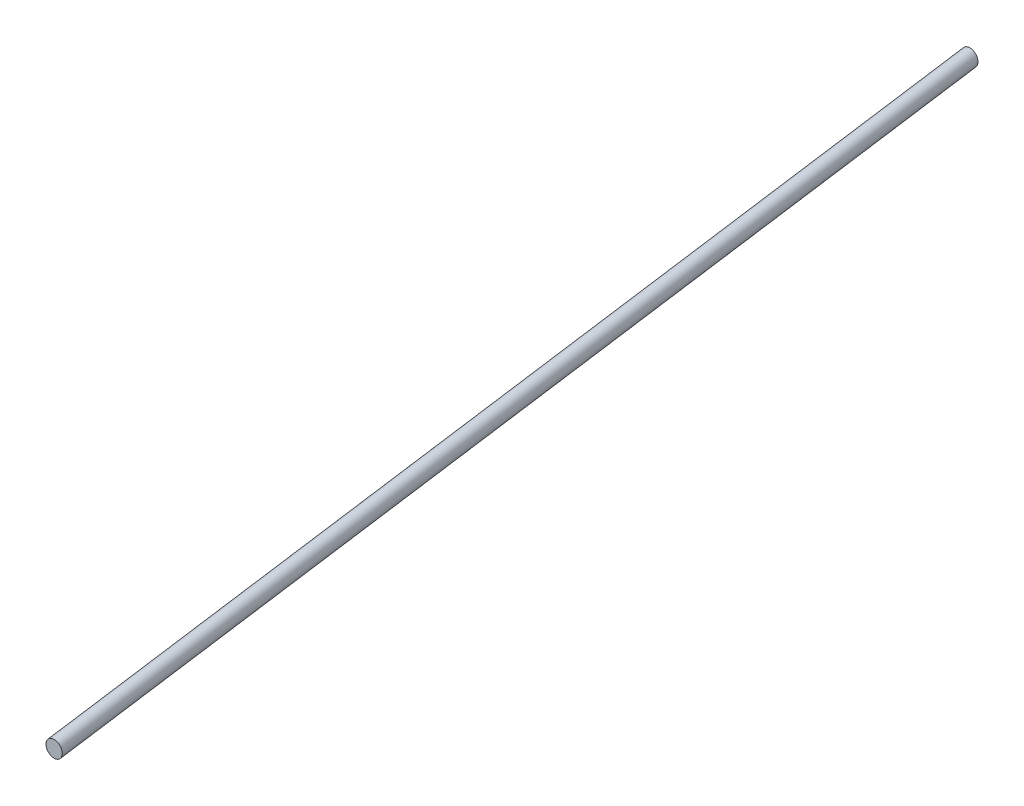
ISO-10303-21;
HEADER;
FILE_DESCRIPTION(('STEP AP214'),'2;1');
FILE_NAME('part.step','',(''),(''),'','','');
FILE_SCHEMA(('AUTOMOTIVE_DESIGN { 1 0 10303 214 1 1 1 1 }'));
ENDSEC;
DATA;
#1=APPLICATION_CONTEXT('core data for automotive mechanical design processes');
#2=APPLICATION_PROTOCOL_DEFINITION('international standard','automotive_design',2000,#1);
#3=PRODUCT_CONTEXT('',#1,'mechanical');
#4=PRODUCT('Part','Part','',(#3));
#5=PRODUCT_RELATED_PRODUCT_CATEGORY('part','',(#4));
#6=PRODUCT_DEFINITION_FORMATION('','',#4);
#7=PRODUCT_DEFINITION_CONTEXT('part definition',#1,'design');
#8=PRODUCT_DEFINITION('design','',#6,#7);
#9=PRODUCT_DEFINITION_SHAPE('','',#8);
#10=(LENGTH_UNIT() NAMED_UNIT(*) SI_UNIT(.MILLI.,.METRE.));
#11=(NAMED_UNIT(*) PLANE_ANGLE_UNIT() SI_UNIT($,.RADIAN.));
#12=(NAMED_UNIT(*) SI_UNIT($,.STERADIAN.) SOLID_ANGLE_UNIT());
#13=UNCERTAINTY_MEASURE_WITH_UNIT(LENGTH_MEASURE(1.E-05),#10,'distance_accuracy_value','');
#14=(GEOMETRIC_REPRESENTATION_CONTEXT(3) GLOBAL_UNCERTAINTY_ASSIGNED_CONTEXT((#13)) GLOBAL_UNIT_ASSIGNED_CONTEXT((#10,
#11,#12)) REPRESENTATION_CONTEXT('',''));
#15=CARTESIAN_POINT('',(0.,0.,0.));
#16=DIRECTION('',(0.,0.,1.));
#17=DIRECTION('',(1.,0.,0.));
#18=AXIS2_PLACEMENT_3D('',#15,#16,#17);
#19=CARTESIAN_POINT('',(19.1,2.1,0.));
#20=DIRECTION('',(0.,0.,1.));
#21=DIRECTION('',(1.,0.,0.));
#22=AXIS2_PLACEMENT_3D('',#19,#20,#21);
#23=PLANE('',#22);
#24=CARTESIAN_POINT('',(19.1,2.1,0.));
#25=DIRECTION('',(0.,0.,1.));
#26=DIRECTION('',(1.,0.,0.));
#27=AXIS2_PLACEMENT_3D('',#24,#25,#26);
#28=CIRCLE('',#27,4.);
#29=CARTESIAN_POINT('',(23.1,2.1,0.));
#30=VERTEX_POINT('',#29);
#31=EDGE_CURVE('E42',#30,#30,#28,.T.);
#32=ORIENTED_EDGE('',*,*,#31,.F.);
#33=EDGE_LOOP('',(#32));
#34=FACE_BOUND('',#33,.T.);
#35=ADVANCED_FACE('F36',(#34),#23,.F.);
#36=CARTESIAN_POINT('',(88.4,2.1,519.));
#37=DIRECTION('',(0.,0.,1.));
#38=DIRECTION('',(1.,0.,0.));
#39=AXIS2_PLACEMENT_3D('',#36,#37,#38);
#40=PLANE('',#39);
#41=CARTESIAN_POINT('',(88.4,2.1,519.));
#42=DIRECTION('',(0.,0.,1.));
#43=DIRECTION('',(1.,0.,0.));
#44=AXIS2_PLACEMENT_3D('',#41,#42,#43);
#45=CIRCLE('',#44,4.);
#46=CARTESIAN_POINT('',(92.4,2.1,519.));
#47=VERTEX_POINT('',#46);
#48=EDGE_CURVE('E10',#47,#47,#45,.T.);
#49=ORIENTED_EDGE('',*,*,#48,.T.);
#50=EDGE_LOOP('',(#49));
#51=FACE_BOUND('',#50,.T.);
#52=ADVANCED_FACE('F51',(#51),#40,.T.);
#53=CARTESIAN_POINT('',(23.1,2.1,0.));
#54=CARTESIAN_POINT('',(92.4,2.1,519.));
#55=CARTESIAN_POINT('',(23.1,10.1,0.));
#56=CARTESIAN_POINT('',(92.4,10.1,519.));
#57=CARTESIAN_POINT('',(15.1,10.1,0.));
#58=CARTESIAN_POINT('',(84.4,10.1,519.));
#59=CARTESIAN_POINT('',(15.1,2.1,0.));
#60=CARTESIAN_POINT('',(84.4,2.1,519.));
#61=CARTESIAN_POINT('',(15.1,-5.9,0.));
#62=CARTESIAN_POINT('',(84.4,-5.9,519.));
#63=CARTESIAN_POINT('',(23.1,-5.9,0.));
#64=CARTESIAN_POINT('',(92.4,-5.9,519.));
#65=CARTESIAN_POINT('',(23.1,2.1,0.));
#66=CARTESIAN_POINT('',(92.4,2.1,519.));
#67=(BOUNDED_SURFACE() B_SPLINE_SURFACE(3,1,((#53,#54),(#55,#56),(#57,#58),(#59,#60),(#61,#62),
(#63,#64),(#65,#66)),.UNSPECIFIED.,.T.,.F.,.F.) B_SPLINE_SURFACE_WITH_KNOTS((4,3,4),(2,2),(0.,
0.5,1.),(0.,1.),.UNSPECIFIED.) GEOMETRIC_REPRESENTATION_ITEM() RATIONAL_B_SPLINE_SURFACE(((1.,
1.),(0.333333333333333,0.333333333333333),(0.333333333333333,0.333333333333333),(1.,1.),
(0.333333333333333,0.333333333333333),(0.333333333333333,0.333333333333333),(1.,1.))) REPRESENTATION_ITEM('') SURFACE());
#68=CARTESIAN_POINT('',(92.4,2.1,519.));
#69=CARTESIAN_POINT('',(91.678125,2.1,513.59375));
#70=CARTESIAN_POINT('',(90.95625,2.1,508.1875));
#71=CARTESIAN_POINT('',(89.5125,2.1,497.375));
#72=CARTESIAN_POINT('',(88.790625,2.1,491.96875));
#73=CARTESIAN_POINT('',(87.346875,2.1,481.15625));
#74=CARTESIAN_POINT('',(86.625,2.1,475.75));
#75=CARTESIAN_POINT('',(85.18125,2.1,464.9375));
#76=CARTESIAN_POINT('',(84.459375,2.1,459.53125));
#77=CARTESIAN_POINT('',(83.015625,2.1,448.71875));
#78=CARTESIAN_POINT('',(82.29375,2.1,443.3125));
#79=CARTESIAN_POINT('',(80.85,2.1,432.5));
#80=CARTESIAN_POINT('',(80.128125,2.1,427.09375));
#81=CARTESIAN_POINT('',(78.684375,2.1,416.28125));
#82=CARTESIAN_POINT('',(77.9625,2.1,410.875));
#83=CARTESIAN_POINT('',(76.51875,2.1,400.0625));
#84=CARTESIAN_POINT('',(75.796875,2.1,394.65625));
#85=CARTESIAN_POINT('',(74.353125,2.1,383.84375));
#86=CARTESIAN_POINT('',(73.63125,2.1,378.4375));
#87=CARTESIAN_POINT('',(72.1875,2.1,367.625));
#88=CARTESIAN_POINT('',(71.465625,2.1,362.21875));
#89=CARTESIAN_POINT('',(70.021875,2.1,351.40625));
#90=CARTESIAN_POINT('',(69.3,2.1,346.));
#91=CARTESIAN_POINT('',(67.85625,2.1,335.1875));
#92=CARTESIAN_POINT('',(67.134375,2.1,329.78125));
#93=CARTESIAN_POINT('',(65.690625,2.1,318.96875));
#94=CARTESIAN_POINT('',(64.96875,2.1,313.5625));
#95=CARTESIAN_POINT('',(63.525,2.1,302.75));
#96=CARTESIAN_POINT('',(62.803125,2.1,297.34375));
#97=CARTESIAN_POINT('',(61.359375,2.1,286.53125));
#98=CARTESIAN_POINT('',(60.6375,2.1,281.125));
#99=CARTESIAN_POINT('',(59.19375,2.1,270.3125));
#100=CARTESIAN_POINT('',(58.471875,2.1,264.90625));
#101=CARTESIAN_POINT('',(57.028125,2.1,254.09375));
#102=CARTESIAN_POINT('',(56.30625,2.1,248.6875));
#103=CARTESIAN_POINT('',(54.8625,2.1,237.875));
#104=CARTESIAN_POINT('',(54.140625,2.1,232.46875));
#105=CARTESIAN_POINT('',(52.696875,2.1,221.65625));
#106=CARTESIAN_POINT('',(51.975,2.1,216.25));
#107=CARTESIAN_POINT('',(50.53125,2.1,205.4375));
#108=CARTESIAN_POINT('',(49.809375,2.1,200.03125));
#109=CARTESIAN_POINT('',(48.365625,2.1,189.21875));
#110=CARTESIAN_POINT('',(47.64375,2.1,183.8125));
#111=CARTESIAN_POINT('',(46.2,2.1,173.));
#112=CARTESIAN_POINT('',(45.478125,2.1,167.59375));
#113=CARTESIAN_POINT('',(44.034375,2.1,156.78125));
#114=CARTESIAN_POINT('',(43.3125,2.1,151.375));
#115=CARTESIAN_POINT('',(41.86875,2.1,140.5625));
#116=CARTESIAN_POINT('',(41.146875,2.1,135.15625));
#117=CARTESIAN_POINT('',(39.703125,2.1,124.34375));
#118=CARTESIAN_POINT('',(38.98125,2.1,118.9375));
#119=CARTESIAN_POINT('',(37.5375,2.1,108.125));
#120=CARTESIAN_POINT('',(36.815625,2.1,102.71875));
#121=CARTESIAN_POINT('',(35.371875,2.1,91.90625));
#122=CARTESIAN_POINT('',(34.65,2.1,86.5));
#123=CARTESIAN_POINT('',(33.20625,2.1,75.6875));
#124=CARTESIAN_POINT('',(32.484375,2.1,70.28125));
#125=CARTESIAN_POINT('',(31.040625,2.1,59.46875));
#126=CARTESIAN_POINT('',(30.31875,2.1,54.0625));
#127=CARTESIAN_POINT('',(28.875,2.1,43.25));
#128=CARTESIAN_POINT('',(28.153125,2.1,37.84375));
#129=CARTESIAN_POINT('',(26.709375,2.1,27.03125));
#130=CARTESIAN_POINT('',(25.9875,2.1,21.625));
#131=CARTESIAN_POINT('',(24.54375,2.1,10.8125));
#132=CARTESIAN_POINT('',(23.821875,2.1,5.40625000000001));
#133=CARTESIAN_POINT('',(23.1,2.1,0.));
#134=B_SPLINE_CURVE_WITH_KNOTS('',3,(#68,#69,#70,#71,#72,#73,#74,#75,#76,#77,#78,#79,#80,#81,
#82,#83,#84,#85,#86,#87,#88,#89,#90,#91,#92,#93,#94,#95,#96,#97,#98,#99,#100,#101,#102,#103,
#104,#105,#106,#107,#108,#109,#110,#111,#112,#113,#114,#115,#116,#117,#118,#119,#120,#121,#122,
#123,#124,#125,#126,#127,#128,#129,#130,#131,#132,#133),.UNSPECIFIED.,.F.,.F.,(4,2,2,2,2,2,2,2,
2,2,2,2,2,2,2,2,2,2,2,2,2,2,2,2,2,2,2,2,2,2,2,2,4),(0.,16.3626948637174,32.7253897274349,
49.0880845911523,65.4507794548698,81.8134743185872,98.1761691823046,114.538864046022,
130.90155890974,147.264253773457,163.626948637174,179.989643500892,196.352338364609,
212.715033228327,229.077728092044,245.440422955762,261.803117819479,278.165812683196,
294.528507546914,310.891202410631,327.253897274349,343.616592138066,359.979287001784,
376.341981865501,392.704676729218,409.067371592936,425.430066456653,441.792761320371,
458.155456184088,474.518151047806,490.880845911523,507.243540775241,523.606235638958),.UNSPECIFIED.);
#135=EDGE_CURVE('BSEAM48',#47,#30,#134,.T.);
#136=ORIENTED_EDGE('',*,*,#48,.F.);
#137=ORIENTED_EDGE('',*,*,#31,.T.);
#138=ORIENTED_EDGE('',*,*,#135,.T.);
#139=ORIENTED_EDGE('',*,*,#135,.F.);
#140=EDGE_LOOP('',(#136,#138,#137,#139));
#141=FACE_BOUND('',#140,.T.);
#142=ADVANCED_FACE('F48',(#141),#67,.T.);
#143=CLOSED_SHELL('',(#35,#52,#142));
#144=MANIFOLD_SOLID_BREP('B2',#143);
#145=ADVANCED_BREP_SHAPE_REPRESENTATION('',(#18,#144),#14);
#146=SHAPE_DEFINITION_REPRESENTATION(#9,#145);
ENDSEC;
END-ISO-10303-21;
